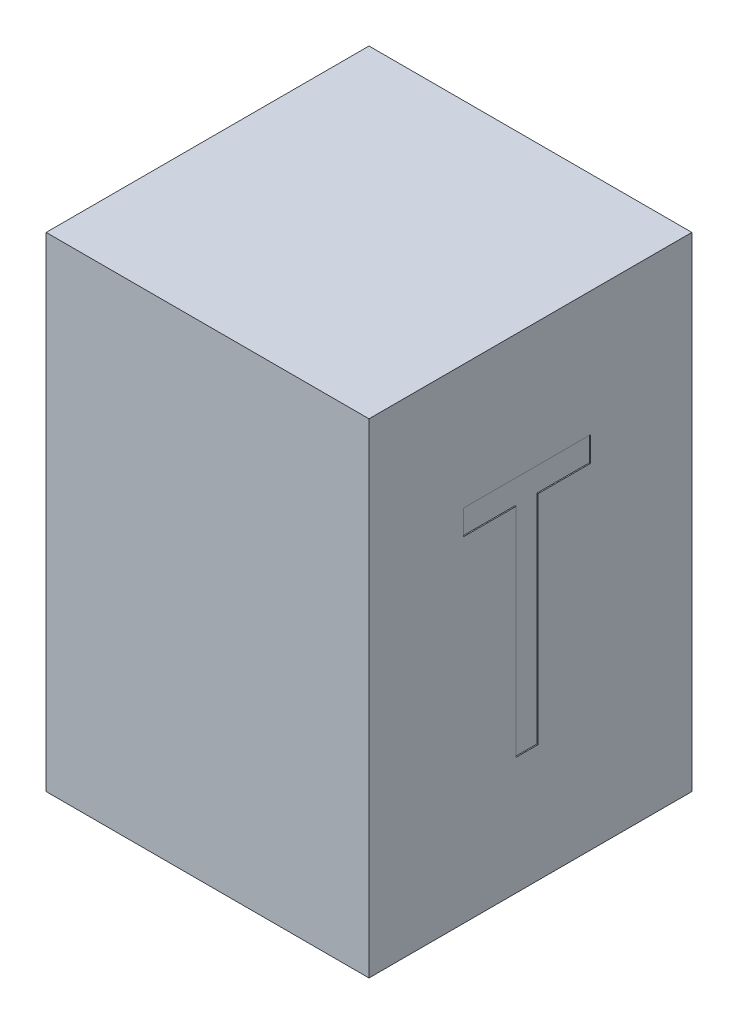
ISO-10303-21;
HEADER;
FILE_DESCRIPTION(('STEP AP214'),'2;1');
FILE_NAME('part.step','',(''),(''),'','','');
FILE_SCHEMA(('AUTOMOTIVE_DESIGN { 1 0 10303 214 1 1 1 1 }'));
ENDSEC;
DATA;
#1=APPLICATION_CONTEXT('core data for automotive mechanical design processes');
#2=APPLICATION_PROTOCOL_DEFINITION('international standard','automotive_design',2000,#1);
#3=PRODUCT_CONTEXT('',#1,'mechanical');
#4=PRODUCT('Part','Part','',(#3));
#5=PRODUCT_RELATED_PRODUCT_CATEGORY('part','',(#4));
#6=PRODUCT_DEFINITION_FORMATION('','',#4);
#7=PRODUCT_DEFINITION_CONTEXT('part definition',#1,'design');
#8=PRODUCT_DEFINITION('design','',#6,#7);
#9=PRODUCT_DEFINITION_SHAPE('','',#8);
#10=(LENGTH_UNIT() NAMED_UNIT(*) SI_UNIT(.MILLI.,.METRE.));
#11=(NAMED_UNIT(*) PLANE_ANGLE_UNIT() SI_UNIT($,.RADIAN.));
#12=(NAMED_UNIT(*) SI_UNIT($,.STERADIAN.) SOLID_ANGLE_UNIT());
#13=UNCERTAINTY_MEASURE_WITH_UNIT(LENGTH_MEASURE(1.E-05),#10,'distance_accuracy_value','');
#14=(GEOMETRIC_REPRESENTATION_CONTEXT(3) GLOBAL_UNCERTAINTY_ASSIGNED_CONTEXT((#13)) GLOBAL_UNIT_ASSIGNED_CONTEXT((#10,
#11,#12)) REPRESENTATION_CONTEXT('',''));
#15=CARTESIAN_POINT('',(0.,0.,0.));
#16=DIRECTION('',(0.,0.,1.));
#17=DIRECTION('',(1.,0.,0.));
#18=AXIS2_PLACEMENT_3D('',#15,#16,#17);
#19=CARTESIAN_POINT('',(76.2,114.3,0.));
#20=DIRECTION('',(-0.999999999999995,0.,0.));
#21=DIRECTION('',(0.,0.,0.999999999999995));
#22=AXIS2_PLACEMENT_3D('',#19,#20,#21);
#23=PLANE('',#22);
#24=DIRECTION('',(0.,0.,-0.999999999999995));
#25=VECTOR('',#24,1.);
#26=CARTESIAN_POINT('',(76.1999999999997,0.,0.));
#27=LINE('',#26,#25);
#28=CARTESIAN_POINT('',(76.2,0.,76.2));
#29=VERTEX_POINT('',#28);
#30=CARTESIAN_POINT('',(76.1999999999997,0.,0.));
#31=VERTEX_POINT('',#30);
#32=EDGE_CURVE('E171',#29,#31,#27,.T.);
#33=ORIENTED_EDGE('',*,*,#32,.T.);
#34=DIRECTION('',(0.,-1.,0.));
#35=VECTOR('',#34,1.);
#36=CARTESIAN_POINT('',(76.2,114.3,0.));
#37=LINE('',#36,#35);
#38=CARTESIAN_POINT('',(76.2,114.3,0.));
#39=VERTEX_POINT('',#38);
#40=EDGE_CURVE('E175',#39,#31,#37,.T.);
#41=ORIENTED_EDGE('',*,*,#40,.F.);
#42=DIRECTION('',(0.,0.,-0.999999999999995));
#43=VECTOR('',#42,1.);
#44=CARTESIAN_POINT('',(76.2,114.3,0.));
#45=LINE('',#44,#43);
#46=CARTESIAN_POINT('',(76.1999999999991,114.3,76.2));
#47=VERTEX_POINT('',#46);
#48=EDGE_CURVE('E166',#47,#39,#45,.T.);
#49=ORIENTED_EDGE('',*,*,#48,.F.);
#50=DIRECTION('',(0.,-1.,0.));
#51=VECTOR('',#50,1.);
#52=CARTESIAN_POINT('',(76.1999999999991,114.3,76.2));
#53=LINE('',#52,#51);
#54=EDGE_CURVE('E42',#47,#29,#53,.T.);
#55=ORIENTED_EDGE('',*,*,#54,.T.);
#56=EDGE_LOOP('',(#33,#41,#49,#55));
#57=FACE_BOUND('',#56,.T.);
#58=DIRECTION('',(0.,0.,0.999999999999995));
#59=VECTOR('',#58,1.);
#60=CARTESIAN_POINT('',(76.1999999999998,79.0413021057861,41.4622180348947));
#61=LINE('',#60,#59);
#62=CARTESIAN_POINT('',(76.1999999999998,79.0413021057861,41.4622180348947));
#63=VERTEX_POINT('',#62);
#64=CARTESIAN_POINT('',(76.1999999999998,79.0413021057862,53.9179872656641));
#65=VERTEX_POINT('',#64);
#66=EDGE_CURVE('E49',#63,#65,#61,.T.);
#67=ORIENTED_EDGE('',*,*,#66,.T.);
#68=DIRECTION('',(0.,1.,0.));
#69=VECTOR('',#68,1.);
#70=CARTESIAN_POINT('',(76.1999999999998,79.0413021057862,53.9179872656641));
#71=LINE('',#70,#69);
#72=CARTESIAN_POINT('',(76.1999999999998,84.9028405673246,53.9179872656641));
#73=VERTEX_POINT('',#72);
#74=EDGE_CURVE('E152',#65,#73,#71,.T.);
#75=ORIENTED_EDGE('',*,*,#74,.T.);
#76=DIRECTION('',(0.,0.,-0.999999999999995));
#77=VECTOR('',#76,1.);
#78=CARTESIAN_POINT('',(76.1999999999998,84.9028405673246,53.9179872656641));
#79=LINE('',#78,#77);
#80=CARTESIAN_POINT('',(76.1999999999995,84.9028405673246,23.8776026502792));
#81=VERTEX_POINT('',#80);
#82=EDGE_CURVE('E346',#73,#81,#79,.T.);
#83=ORIENTED_EDGE('',*,*,#82,.T.);
#84=DIRECTION('',(0.,-1.,0.));
#85=VECTOR('',#84,1.);
#86=CARTESIAN_POINT('',(76.1999999999995,84.9028405673246,23.8776026502792));
#87=LINE('',#86,#85);
#88=CARTESIAN_POINT('',(76.1999999999995,79.0413021057861,23.8776026502792));
#89=VERTEX_POINT('',#88);
#90=EDGE_CURVE('E348',#81,#89,#87,.T.);
#91=ORIENTED_EDGE('',*,*,#90,.T.);
#92=DIRECTION('',(0.,0.,0.999999999999995));
#93=VECTOR('',#92,1.);
#94=CARTESIAN_POINT('',(76.1999999999995,79.0413021057861,23.8776026502792));
#95=LINE('',#94,#93);
#96=CARTESIAN_POINT('',(76.2,79.0413021057861,36.3333718810486));
#97=VERTEX_POINT('',#96);
#98=EDGE_CURVE('E330',#89,#97,#95,.T.);
#99=ORIENTED_EDGE('',*,*,#98,.T.);
#100=DIRECTION('',(0.,-1.,0.));
#101=VECTOR('',#100,1.);
#102=CARTESIAN_POINT('',(76.2,79.0413021057861,36.3333718810486));
#103=LINE('',#102,#101);
#104=CARTESIAN_POINT('',(76.1999999999991,27.7528405673246,36.3333718810486));
#105=VERTEX_POINT('',#104);
#106=EDGE_CURVE('E327',#97,#105,#103,.T.);
#107=ORIENTED_EDGE('',*,*,#106,.T.);
#108=DIRECTION('',(0.,0.,0.999999999999995));
#109=VECTOR('',#108,1.);
#110=CARTESIAN_POINT('',(76.1999999999991,27.7528405673246,36.3333718810486));
#111=LINE('',#110,#109);
#112=CARTESIAN_POINT('',(76.2,27.7528405673246,41.4622180348947));
#113=VERTEX_POINT('',#112);
#114=EDGE_CURVE('E321',#105,#113,#111,.T.);
#115=ORIENTED_EDGE('',*,*,#114,.T.);
#116=DIRECTION('',(0.,1.,0.));
#117=VECTOR('',#116,1.);
#118=CARTESIAN_POINT('',(76.2,27.7528405673246,41.4622180348947));
#119=LINE('',#118,#117);
#120=EDGE_CURVE('E148',#113,#63,#119,.T.);
#121=ORIENTED_EDGE('',*,*,#120,.T.);
#122=EDGE_LOOP('',(#67,#75,#83,#91,#99,#107,#115,#121));
#123=FACE_BOUND('',#122,.T.);
#124=ADVANCED_FACE('F34',(#57,#123),#23,.F.);
#125=CARTESIAN_POINT('',(0.,114.3,0.));
#126=DIRECTION('',(0.999999999999995,0.,0.));
#127=DIRECTION('',(0.,0.,-0.999999999999995));
#128=AXIS2_PLACEMENT_3D('',#125,#126,#127);
#129=PLANE('',#128);
#130=DIRECTION('',(0.,0.,0.999999999999995));
#131=VECTOR('',#130,1.);
#132=CARTESIAN_POINT('',(0.,0.,0.));
#133=LINE('',#132,#131);
#134=CARTESIAN_POINT('',(0.,0.,0.));
#135=VERTEX_POINT('',#134);
#136=CARTESIAN_POINT('',(0.,0.,76.2));
#137=VERTEX_POINT('',#136);
#138=EDGE_CURVE('E153',#135,#137,#133,.T.);
#139=ORIENTED_EDGE('',*,*,#138,.T.);
#140=DIRECTION('',(0.,-1.,0.));
#141=VECTOR('',#140,1.);
#142=CARTESIAN_POINT('',(0.,114.3,76.2));
#143=LINE('',#142,#141);
#144=CARTESIAN_POINT('',(0.,114.3,76.2));
#145=VERTEX_POINT('',#144);
#146=EDGE_CURVE('E11',#145,#137,#143,.T.);
#147=ORIENTED_EDGE('',*,*,#146,.F.);
#148=DIRECTION('',(0.,0.,0.999999999999995));
#149=VECTOR('',#148,1.);
#150=CARTESIAN_POINT('',(0.,114.3,0.));
#151=LINE('',#150,#149);
#152=CARTESIAN_POINT('',(0.,114.3,0.));
#153=VERTEX_POINT('',#152);
#154=EDGE_CURVE('E163',#153,#145,#151,.T.);
#155=ORIENTED_EDGE('',*,*,#154,.F.);
#156=DIRECTION('',(0.,-1.,0.));
#157=VECTOR('',#156,1.);
#158=CARTESIAN_POINT('',(0.,114.3,0.));
#159=LINE('',#158,#157);
#160=EDGE_CURVE('E168',#153,#135,#159,.T.);
#161=ORIENTED_EDGE('',*,*,#160,.T.);
#162=EDGE_LOOP('',(#139,#147,#155,#161));
#163=FACE_BOUND('',#162,.T.);
#164=ADVANCED_FACE('F36',(#163),#129,.F.);
#165=CARTESIAN_POINT('',(0.,114.3,76.2));
#166=DIRECTION('',(0.,0.,-0.999999999999995));
#167=DIRECTION('',(-0.999999999999995,0.,0.));
#168=AXIS2_PLACEMENT_3D('',#165,#166,#167);
#169=PLANE('',#168);
#170=DIRECTION('',(0.999999999999995,0.,0.));
#171=VECTOR('',#170,1.);
#172=CARTESIAN_POINT('',(0.,0.,76.2));
#173=LINE('',#172,#171);
#174=EDGE_CURVE('E157',#137,#29,#173,.T.);
#175=ORIENTED_EDGE('',*,*,#174,.T.);
#176=ORIENTED_EDGE('',*,*,#54,.F.);
#177=DIRECTION('',(0.999999999999995,0.,0.));
#178=VECTOR('',#177,1.);
#179=CARTESIAN_POINT('',(0.,114.3,76.2));
#180=LINE('',#179,#178);
#181=EDGE_CURVE('E86',#145,#47,#180,.T.);
#182=ORIENTED_EDGE('',*,*,#181,.F.);
#183=ORIENTED_EDGE('',*,*,#146,.T.);
#184=EDGE_LOOP('',(#175,#176,#182,#183));
#185=FACE_BOUND('',#184,.T.);
#186=ADVANCED_FACE('F191',(#185),#169,.F.);
#187=CARTESIAN_POINT('',(0.,114.3,0.));
#188=DIRECTION('',(0.,0.,0.999999999999995));
#189=DIRECTION('',(0.999999999999995,0.,0.));
#190=AXIS2_PLACEMENT_3D('',#187,#188,#189);
#191=PLANE('',#190);
#192=DIRECTION('',(-0.999999999999995,0.,0.));
#193=VECTOR('',#192,1.);
#194=CARTESIAN_POINT('',(0.,0.,0.));
#195=LINE('',#194,#193);
#196=EDGE_CURVE('E79',#31,#135,#195,.T.);
#197=ORIENTED_EDGE('',*,*,#196,.T.);
#198=ORIENTED_EDGE('',*,*,#160,.F.);
#199=DIRECTION('',(-0.999999999999995,0.,0.));
#200=VECTOR('',#199,1.);
#201=CARTESIAN_POINT('',(0.,114.3,0.));
#202=LINE('',#201,#200);
#203=EDGE_CURVE('E58',#39,#153,#202,.T.);
#204=ORIENTED_EDGE('',*,*,#203,.F.);
#205=ORIENTED_EDGE('',*,*,#40,.T.);
#206=EDGE_LOOP('',(#197,#198,#204,#205));
#207=FACE_BOUND('',#206,.T.);
#208=ADVANCED_FACE('F188',(#207),#191,.F.);
#209=CARTESIAN_POINT('',(0.,114.3,0.));
#210=DIRECTION('',(0.,1.,0.));
#211=DIRECTION('',(0.,0.,0.999999999999995));
#212=AXIS2_PLACEMENT_3D('',#209,#210,#211);
#213=PLANE('',#212);
#214=ORIENTED_EDGE('',*,*,#154,.T.);
#215=ORIENTED_EDGE('',*,*,#181,.T.);
#216=ORIENTED_EDGE('',*,*,#48,.T.);
#217=ORIENTED_EDGE('',*,*,#203,.T.);
#218=EDGE_LOOP('',(#214,#215,#216,#217));
#219=FACE_BOUND('',#218,.T.);
#220=ADVANCED_FACE('F190',(#219),#213,.T.);
#221=CARTESIAN_POINT('',(0.,0.,0.));
#222=DIRECTION('',(0.,1.,0.));
#223=DIRECTION('',(0.,0.,0.999999999999995));
#224=AXIS2_PLACEMENT_3D('',#221,#222,#223);
#225=PLANE('',#224);
#226=ORIENTED_EDGE('',*,*,#138,.F.);
#227=ORIENTED_EDGE('',*,*,#196,.F.);
#228=ORIENTED_EDGE('',*,*,#32,.F.);
#229=ORIENTED_EDGE('',*,*,#174,.F.);
#230=EDGE_LOOP('',(#226,#227,#228,#229));
#231=FACE_BOUND('',#230,.T.);
#232=ADVANCED_FACE('F184',(#231),#225,.F.);
#233=CARTESIAN_POINT('',(75.9459999999994,79.0413021057861,41.4622180348947));
#234=DIRECTION('',(0.,1.,0.));
#235=DIRECTION('',(0.,0.,0.999999999999995));
#236=AXIS2_PLACEMENT_3D('',#233,#234,#235);
#237=PLANE('',#236);
#238=ORIENTED_EDGE('',*,*,#66,.F.);
#239=DIRECTION('',(0.999999999999995,0.,0.));
#240=VECTOR('',#239,1.);
#241=CARTESIAN_POINT('',(75.9459999999994,79.0413021057861,41.4622180348947));
#242=LINE('',#241,#240);
#243=CARTESIAN_POINT('',(75.9459999999994,79.0413021057861,41.4622180348947));
#244=VERTEX_POINT('',#243);
#245=EDGE_CURVE('E147',#244,#63,#242,.T.);
#246=ORIENTED_EDGE('',*,*,#245,.F.);
#247=DIRECTION('',(0.,0.,0.999999999999995));
#248=VECTOR('',#247,1.);
#249=CARTESIAN_POINT('',(75.9459999999994,79.0413021057861,41.4622180348947));
#250=LINE('',#249,#248);
#251=CARTESIAN_POINT('',(75.9459999999998,79.0413021057862,53.9179872656641));
#252=VERTEX_POINT('',#251);
#253=EDGE_CURVE('E138',#244,#252,#250,.T.);
#254=ORIENTED_EDGE('',*,*,#253,.T.);
#255=DIRECTION('',(0.999999999999995,0.,0.));
#256=VECTOR('',#255,1.);
#257=CARTESIAN_POINT('',(75.9459999999998,79.0413021057862,53.9179872656641));
#258=LINE('',#257,#256);
#259=EDGE_CURVE('E146',#252,#65,#258,.T.);
#260=ORIENTED_EDGE('',*,*,#259,.T.);
#261=EDGE_LOOP('',(#238,#246,#254,#260));
#262=FACE_BOUND('',#261,.T.);
#263=ADVANCED_FACE('F145',(#262),#237,.T.);
#264=CARTESIAN_POINT('',(75.9459999999998,79.0413021057862,53.9179872656641));
#265=DIRECTION('',(0.,0.,-0.999999999999995));
#266=DIRECTION('',(-0.999999999999995,0.,0.));
#267=AXIS2_PLACEMENT_3D('',#264,#265,#266);
#268=PLANE('',#267);
#269=ORIENTED_EDGE('',*,*,#74,.F.);
#270=ORIENTED_EDGE('',*,*,#259,.F.);
#271=DIRECTION('',(0.,1.,0.));
#272=VECTOR('',#271,1.);
#273=CARTESIAN_POINT('',(75.9459999999998,79.0413021057862,53.9179872656641));
#274=LINE('',#273,#272);
#275=CARTESIAN_POINT('',(75.9459999999998,84.9028405673246,53.9179872656641));
#276=VERTEX_POINT('',#275);
#277=EDGE_CURVE('E134',#252,#276,#274,.T.);
#278=ORIENTED_EDGE('',*,*,#277,.T.);
#279=DIRECTION('',(0.999999999999995,0.,0.));
#280=VECTOR('',#279,1.);
#281=CARTESIAN_POINT('',(75.9459999999998,84.9028405673246,53.9179872656641));
#282=LINE('',#281,#280);
#283=EDGE_CURVE('E154',#276,#73,#282,.T.);
#284=ORIENTED_EDGE('',*,*,#283,.T.);
#285=EDGE_LOOP('',(#269,#270,#278,#284));
#286=FACE_BOUND('',#285,.T.);
#287=ADVANCED_FACE('F150',(#286),#268,.T.);
#288=CARTESIAN_POINT('',(75.9459999999998,84.9028405673246,53.9179872656641));
#289=DIRECTION('',(0.,-1.,0.));
#290=DIRECTION('',(0.,0.,-0.999999999999995));
#291=AXIS2_PLACEMENT_3D('',#288,#289,#290);
#292=PLANE('',#291);
#293=ORIENTED_EDGE('',*,*,#82,.F.);
#294=ORIENTED_EDGE('',*,*,#283,.F.);
#295=DIRECTION('',(0.,0.,-0.999999999999995));
#296=VECTOR('',#295,1.);
#297=CARTESIAN_POINT('',(75.9459999999998,84.9028405673246,53.9179872656641));
#298=LINE('',#297,#296);
#299=CARTESIAN_POINT('',(75.9459999999993,84.9028405673246,23.8776026502792));
#300=VERTEX_POINT('',#299);
#301=EDGE_CURVE('E140',#276,#300,#298,.T.);
#302=ORIENTED_EDGE('',*,*,#301,.T.);
#303=DIRECTION('',(0.999999999999995,0.,0.));
#304=VECTOR('',#303,1.);
#305=CARTESIAN_POINT('',(75.9459999999993,84.9028405673246,23.8776026502792));
#306=LINE('',#305,#304);
#307=EDGE_CURVE('E159',#300,#81,#306,.T.);
#308=ORIENTED_EDGE('',*,*,#307,.T.);
#309=EDGE_LOOP('',(#293,#294,#302,#308));
#310=FACE_BOUND('',#309,.T.);
#311=ADVANCED_FACE('F245',(#310),#292,.T.);
#312=CARTESIAN_POINT('',(75.9459999999993,84.9028405673246,23.8776026502792));
#313=DIRECTION('',(0.,0.,0.999999999999995));
#314=DIRECTION('',(0.999999999999995,0.,0.));
#315=AXIS2_PLACEMENT_3D('',#312,#313,#314);
#316=PLANE('',#315);
#317=ORIENTED_EDGE('',*,*,#90,.F.);
#318=ORIENTED_EDGE('',*,*,#307,.F.);
#319=DIRECTION('',(0.,-1.,0.));
#320=VECTOR('',#319,1.);
#321=CARTESIAN_POINT('',(75.9459999999993,84.9028405673246,23.8776026502792));
#322=LINE('',#321,#320);
#323=CARTESIAN_POINT('',(75.9459999999993,79.0413021057861,23.8776026502792));
#324=VERTEX_POINT('',#323);
#325=EDGE_CURVE('E367',#300,#324,#322,.T.);
#326=ORIENTED_EDGE('',*,*,#325,.T.);
#327=DIRECTION('',(0.999999999999995,0.,0.));
#328=VECTOR('',#327,1.);
#329=CARTESIAN_POINT('',(75.9459999999993,79.0413021057861,23.8776026502792));
#330=LINE('',#329,#328);
#331=EDGE_CURVE('E341',#324,#89,#330,.T.);
#332=ORIENTED_EDGE('',*,*,#331,.T.);
#333=EDGE_LOOP('',(#317,#318,#326,#332));
#334=FACE_BOUND('',#333,.T.);
#335=ADVANCED_FACE('F254',(#334),#316,.T.);
#336=CARTESIAN_POINT('',(75.9459999999993,79.0413021057861,23.8776026502792));
#337=DIRECTION('',(0.,1.,0.));
#338=DIRECTION('',(0.,0.,0.999999999999995));
#339=AXIS2_PLACEMENT_3D('',#336,#337,#338);
#340=PLANE('',#339);
#341=ORIENTED_EDGE('',*,*,#98,.F.);
#342=ORIENTED_EDGE('',*,*,#331,.F.);
#343=DIRECTION('',(0.,0.,0.999999999999995));
#344=VECTOR('',#343,1.);
#345=CARTESIAN_POINT('',(75.9459999999993,79.0413021057861,23.8776026502792));
#346=LINE('',#345,#344);
#347=CARTESIAN_POINT('',(75.9459999999998,79.0413021057861,36.3333718810486));
#348=VERTEX_POINT('',#347);
#349=EDGE_CURVE('E357',#324,#348,#346,.T.);
#350=ORIENTED_EDGE('',*,*,#349,.T.);
#351=DIRECTION('',(0.999999999999995,0.,0.));
#352=VECTOR('',#351,1.);
#353=CARTESIAN_POINT('',(75.9459999999998,79.0413021057861,36.3333718810486));
#354=LINE('',#353,#352);
#355=EDGE_CURVE('E339',#348,#97,#354,.T.);
#356=ORIENTED_EDGE('',*,*,#355,.T.);
#357=EDGE_LOOP('',(#341,#342,#350,#356));
#358=FACE_BOUND('',#357,.T.);
#359=ADVANCED_FACE('F264',(#358),#340,.T.);
#360=CARTESIAN_POINT('',(75.9459999999998,79.0413021057861,36.3333718810486));
#361=DIRECTION('',(0.,0.,0.999999999999995));
#362=DIRECTION('',(0.999999999999995,0.,0.));
#363=AXIS2_PLACEMENT_3D('',#360,#361,#362);
#364=PLANE('',#363);
#365=ORIENTED_EDGE('',*,*,#106,.F.);
#366=ORIENTED_EDGE('',*,*,#355,.F.);
#367=DIRECTION('',(0.,-1.,0.));
#368=VECTOR('',#367,1.);
#369=CARTESIAN_POINT('',(75.9459999999998,79.0413021057861,36.3333718810486));
#370=LINE('',#369,#368);
#371=CARTESIAN_POINT('',(75.9459999999991,27.7528405673246,36.3333718810486));
#372=VERTEX_POINT('',#371);
#373=EDGE_CURVE('E359',#348,#372,#370,.T.);
#374=ORIENTED_EDGE('',*,*,#373,.T.);
#375=DIRECTION('',(0.999999999999995,0.,0.));
#376=VECTOR('',#375,1.);
#377=CARTESIAN_POINT('',(75.9459999999991,27.7528405673246,36.3333718810486));
#378=LINE('',#377,#376);
#379=EDGE_CURVE('E337',#372,#105,#378,.T.);
#380=ORIENTED_EDGE('',*,*,#379,.T.);
#381=EDGE_LOOP('',(#365,#366,#374,#380));
#382=FACE_BOUND('',#381,.T.);
#383=ADVANCED_FACE('F274',(#382),#364,.T.);
#384=CARTESIAN_POINT('',(75.9459999999991,27.7528405673246,36.3333718810486));
#385=DIRECTION('',(0.,1.,0.));
#386=DIRECTION('',(0.,0.,0.999999999999995));
#387=AXIS2_PLACEMENT_3D('',#384,#385,#386);
#388=PLANE('',#387);
#389=ORIENTED_EDGE('',*,*,#114,.F.);
#390=ORIENTED_EDGE('',*,*,#379,.F.);
#391=DIRECTION('',(0.,0.,0.999999999999995));
#392=VECTOR('',#391,1.);
#393=CARTESIAN_POINT('',(75.9459999999991,27.7528405673246,36.3333718810486));
#394=LINE('',#393,#392);
#395=CARTESIAN_POINT('',(75.9459999999998,27.7528405673246,41.4622180348947));
#396=VERTEX_POINT('',#395);
#397=EDGE_CURVE('E361',#372,#396,#394,.T.);
#398=ORIENTED_EDGE('',*,*,#397,.T.);
#399=DIRECTION('',(0.999999999999995,0.,0.));
#400=VECTOR('',#399,1.);
#401=CARTESIAN_POINT('',(75.9459999999998,27.7528405673246,41.4622180348947));
#402=LINE('',#401,#400);
#403=EDGE_CURVE('E320',#396,#113,#402,.T.);
#404=ORIENTED_EDGE('',*,*,#403,.T.);
#405=EDGE_LOOP('',(#389,#390,#398,#404));
#406=FACE_BOUND('',#405,.T.);
#407=ADVANCED_FACE('F284',(#406),#388,.T.);
#408=CARTESIAN_POINT('',(75.9459999999998,27.7528405673246,41.4622180348947));
#409=DIRECTION('',(0.,0.,-0.999999999999995));
#410=DIRECTION('',(-0.999999999999995,0.,0.));
#411=AXIS2_PLACEMENT_3D('',#408,#409,#410);
#412=PLANE('',#411);
#413=ORIENTED_EDGE('',*,*,#120,.F.);
#414=ORIENTED_EDGE('',*,*,#403,.F.);
#415=DIRECTION('',(0.,1.,0.));
#416=VECTOR('',#415,1.);
#417=CARTESIAN_POINT('',(75.9459999999998,27.7528405673246,41.4622180348947));
#418=LINE('',#417,#416);
#419=EDGE_CURVE('E335',#396,#244,#418,.T.);
#420=ORIENTED_EDGE('',*,*,#419,.T.);
#421=ORIENTED_EDGE('',*,*,#245,.T.);
#422=EDGE_LOOP('',(#413,#414,#420,#421));
#423=FACE_BOUND('',#422,.T.);
#424=ADVANCED_FACE('F294',(#423),#412,.T.);
#425=CARTESIAN_POINT('',(75.9459999999998,0.,0.));
#426=DIRECTION('',(-0.999999999999995,0.,0.));
#427=DIRECTION('',(0.,0.,0.999999999999995));
#428=AXIS2_PLACEMENT_3D('',#425,#426,#427);
#429=PLANE('',#428);
#430=ORIENTED_EDGE('',*,*,#253,.F.);
#431=ORIENTED_EDGE('',*,*,#419,.F.);
#432=ORIENTED_EDGE('',*,*,#397,.F.);
#433=ORIENTED_EDGE('',*,*,#373,.F.);
#434=ORIENTED_EDGE('',*,*,#349,.F.);
#435=ORIENTED_EDGE('',*,*,#325,.F.);
#436=ORIENTED_EDGE('',*,*,#301,.F.);
#437=ORIENTED_EDGE('',*,*,#277,.F.);
#438=EDGE_LOOP('',(#430,#431,#432,#433,#434,#435,#436,#437));
#439=FACE_BOUND('',#438,.T.);
#440=ADVANCED_FACE('F136',(#439),#429,.F.);
#441=CLOSED_SHELL('',(#124,#164,#186,#208,#220,#232,#263,#287,#311,#335,#359,#383,#407,#424,#440));
#442=MANIFOLD_SOLID_BREP('B2',#441);
#443=ADVANCED_BREP_SHAPE_REPRESENTATION('',(#18,#442),#14);
#444=SHAPE_DEFINITION_REPRESENTATION(#9,#443);
ENDSEC;
END-ISO-10303-21;
